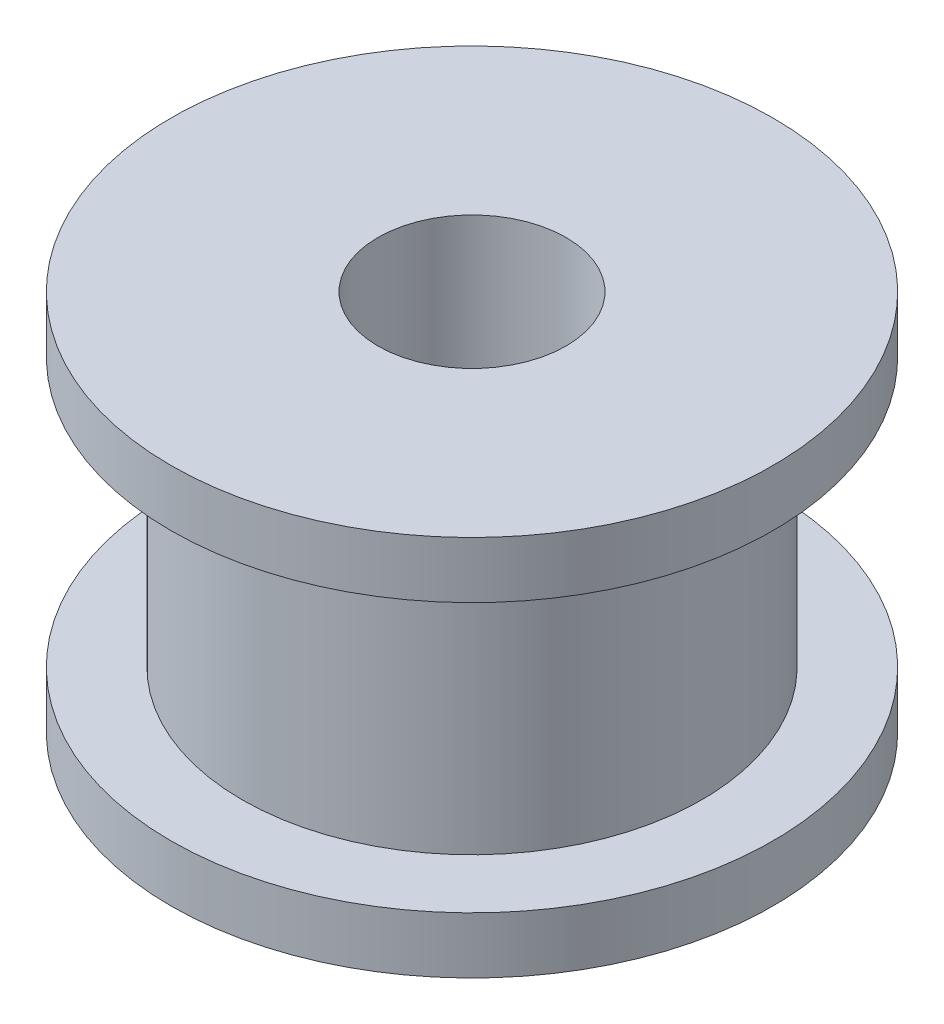
ISO-10303-21;
HEADER;
FILE_DESCRIPTION(('STEP AP214'),'2;1');
FILE_NAME('part.step','',(''),(''),'','','');
FILE_SCHEMA(('AUTOMOTIVE_DESIGN { 1 0 10303 214 1 1 1 1 }'));
ENDSEC;
DATA;
#1=APPLICATION_CONTEXT('core data for automotive mechanical design processes');
#2=APPLICATION_PROTOCOL_DEFINITION('international standard','automotive_design',2000,#1);
#3=PRODUCT_CONTEXT('',#1,'mechanical');
#4=PRODUCT('Part','Part','',(#3));
#5=PRODUCT_RELATED_PRODUCT_CATEGORY('part','',(#4));
#6=PRODUCT_DEFINITION_FORMATION('','',#4);
#7=PRODUCT_DEFINITION_CONTEXT('part definition',#1,'design');
#8=PRODUCT_DEFINITION('design','',#6,#7);
#9=PRODUCT_DEFINITION_SHAPE('','',#8);
#10=(LENGTH_UNIT() NAMED_UNIT(*) SI_UNIT(.MILLI.,.METRE.));
#11=(NAMED_UNIT(*) PLANE_ANGLE_UNIT() SI_UNIT($,.RADIAN.));
#12=(NAMED_UNIT(*) SI_UNIT($,.STERADIAN.) SOLID_ANGLE_UNIT());
#13=UNCERTAINTY_MEASURE_WITH_UNIT(LENGTH_MEASURE(1.E-05),#10,'distance_accuracy_value','');
#14=(GEOMETRIC_REPRESENTATION_CONTEXT(3) GLOBAL_UNCERTAINTY_ASSIGNED_CONTEXT((#13)) GLOBAL_UNIT_ASSIGNED_CONTEXT((#10,
#11,#12)) REPRESENTATION_CONTEXT('',''));
#15=CARTESIAN_POINT('',(0.,0.,0.));
#16=DIRECTION('',(0.,0.,1.));
#17=DIRECTION('',(1.,0.,0.));
#18=AXIS2_PLACEMENT_3D('',#15,#16,#17);
#19=CARTESIAN_POINT('',(0.,7.1,0.));
#20=DIRECTION('',(0.,-1.,0.));
#21=DIRECTION('',(0.,0.,-1.));
#22=AXIS2_PLACEMENT_3D('',#19,#20,#21);
#23=CYLINDRICAL_SURFACE('',#22,8.);
#24=CARTESIAN_POINT('',(0.,7.1,0.));
#25=DIRECTION('',(0.,1.,0.));
#26=DIRECTION('',(0.,0.,1.));
#27=AXIS2_PLACEMENT_3D('',#24,#25,#26);
#28=CIRCLE('',#27,8.);
#29=CARTESIAN_POINT('',(0.,7.1,8.));
#30=VERTEX_POINT('',#29);
#31=EDGE_CURVE('E41',#30,#30,#28,.T.);
#32=ORIENTED_EDGE('',*,*,#31,.F.);
#33=EDGE_LOOP('',(#32));
#34=FACE_BOUND('',#33,.T.);
#35=CARTESIAN_POINT('',(0.,5.6,0.));
#36=DIRECTION('',(0.,-1.,0.));
#37=DIRECTION('',(0.,0.,-1.));
#38=AXIS2_PLACEMENT_3D('',#35,#36,#37);
#39=CIRCLE('',#38,8.);
#40=CARTESIAN_POINT('',(0.,5.6,-8.));
#41=VERTEX_POINT('',#40);
#42=EDGE_CURVE('E59',#41,#41,#39,.T.);
#43=ORIENTED_EDGE('',*,*,#42,.F.);
#44=EDGE_LOOP('',(#43));
#45=FACE_BOUND('',#44,.T.);
#46=ADVANCED_FACE('F34',(#34,#45),#23,.T.);
#47=CARTESIAN_POINT('',(0.,16.,0.));
#48=DIRECTION('',(0.,-1.,0.));
#49=DIRECTION('',(0.,0.,-1.));
#50=AXIS2_PLACEMENT_3D('',#47,#48,#49);
#51=CYLINDRICAL_SURFACE('',#50,2.5);
#52=CARTESIAN_POINT('',(0.,15.74,0.));
#53=DIRECTION('',(0.,1.,0.));
#54=DIRECTION('',(0.,0.,1.));
#55=AXIS2_PLACEMENT_3D('',#52,#53,#54);
#56=CIRCLE('',#55,2.5);
#57=CARTESIAN_POINT('',(0.,15.74,2.5));
#58=VERTEX_POINT('',#57);
#59=EDGE_CURVE('E54',#58,#58,#56,.T.);
#60=ORIENTED_EDGE('',*,*,#59,.T.);
#61=EDGE_LOOP('',(#60));
#62=FACE_BOUND('',#61,.T.);
#63=CARTESIAN_POINT('',(0.,5.6,0.));
#64=DIRECTION('',(0.,-1.,0.));
#65=DIRECTION('',(0.,0.,-1.));
#66=AXIS2_PLACEMENT_3D('',#63,#64,#65);
#67=CIRCLE('',#66,2.5);
#68=CARTESIAN_POINT('',(0.,5.6,-2.5));
#69=VERTEX_POINT('',#68);
#70=EDGE_CURVE('E37',#69,#69,#67,.F.);
#71=ORIENTED_EDGE('',*,*,#70,.F.);
#72=EDGE_LOOP('',(#71));
#73=FACE_BOUND('',#72,.T.);
#74=ADVANCED_FACE('F68',(#62,#73),#51,.F.);
#75=CARTESIAN_POINT('',(0.,7.1,0.));
#76=DIRECTION('',(0.,1.,0.));
#77=DIRECTION('',(0.,0.,1.));
#78=AXIS2_PLACEMENT_3D('',#75,#76,#77);
#79=PLANE('',#78);
#80=CARTESIAN_POINT('',(0.,7.1,0.));
#81=DIRECTION('',(0.,1.,0.));
#82=DIRECTION('',(0.,0.,1.));
#83=AXIS2_PLACEMENT_3D('',#80,#81,#82);
#84=CIRCLE('',#83,6.11);
#85=CARTESIAN_POINT('',(0.,7.1,6.11));
#86=VERTEX_POINT('',#85);
#87=EDGE_CURVE('E10',#86,#86,#84,.T.);
#88=ORIENTED_EDGE('',*,*,#87,.F.);
#89=EDGE_LOOP('',(#88));
#90=FACE_BOUND('',#89,.T.);
#91=ORIENTED_EDGE('',*,*,#31,.T.);
#92=EDGE_LOOP('',(#91));
#93=FACE_BOUND('',#92,.T.);
#94=ADVANCED_FACE('F70',(#90,#93),#79,.T.);
#95=CARTESIAN_POINT('',(0.,14.24,0.));
#96=DIRECTION('',(0.,-1.,0.));
#97=DIRECTION('',(0.,0.,-1.));
#98=AXIS2_PLACEMENT_3D('',#95,#96,#97);
#99=CYLINDRICAL_SURFACE('',#98,6.11);
#100=CARTESIAN_POINT('',(0.,14.24,0.));
#101=DIRECTION('',(0.,1.,0.));
#102=DIRECTION('',(0.,0.,1.));
#103=AXIS2_PLACEMENT_3D('',#100,#101,#102);
#104=CIRCLE('',#103,6.11);
#105=CARTESIAN_POINT('',(0.,14.24,6.11));
#106=VERTEX_POINT('',#105);
#107=EDGE_CURVE('E46',#106,#106,#104,.T.);
#108=ORIENTED_EDGE('',*,*,#107,.F.);
#109=EDGE_LOOP('',(#108));
#110=FACE_BOUND('',#109,.T.);
#111=ORIENTED_EDGE('',*,*,#87,.T.);
#112=EDGE_LOOP('',(#111));
#113=FACE_BOUND('',#112,.T.);
#114=ADVANCED_FACE('F77',(#110,#113),#99,.T.);
#115=CARTESIAN_POINT('',(0.,14.24,0.));
#116=DIRECTION('',(0.,1.,0.));
#117=DIRECTION('',(0.,0.,1.));
#118=AXIS2_PLACEMENT_3D('',#115,#116,#117);
#119=PLANE('',#118);
#120=ORIENTED_EDGE('',*,*,#107,.T.);
#121=EDGE_LOOP('',(#120));
#122=FACE_BOUND('',#121,.T.);
#123=CARTESIAN_POINT('',(0.,14.24,0.));
#124=DIRECTION('',(0.,1.,0.));
#125=DIRECTION('',(0.,0.,1.));
#126=AXIS2_PLACEMENT_3D('',#123,#124,#125);
#127=CIRCLE('',#126,8.);
#128=CARTESIAN_POINT('',(0.,14.24,8.));
#129=VERTEX_POINT('',#128);
#130=EDGE_CURVE('E51',#129,#129,#127,.T.);
#131=ORIENTED_EDGE('',*,*,#130,.F.);
#132=EDGE_LOOP('',(#131));
#133=FACE_BOUND('',#132,.T.);
#134=ADVANCED_FACE('F85',(#122,#133),#119,.F.);
#135=CARTESIAN_POINT('',(0.,15.74,0.));
#136=DIRECTION('',(0.,1.,0.));
#137=DIRECTION('',(0.,0.,1.));
#138=AXIS2_PLACEMENT_3D('',#135,#136,#137);
#139=PLANE('',#138);
#140=ORIENTED_EDGE('',*,*,#59,.F.);
#141=EDGE_LOOP('',(#140));
#142=FACE_BOUND('',#141,.T.);
#143=CARTESIAN_POINT('',(0.,15.74,0.));
#144=DIRECTION('',(0.,1.,0.));
#145=DIRECTION('',(0.,0.,1.));
#146=AXIS2_PLACEMENT_3D('',#143,#144,#145);
#147=CIRCLE('',#146,8.);
#148=CARTESIAN_POINT('',(0.,15.74,8.));
#149=VERTEX_POINT('',#148);
#150=EDGE_CURVE('E50',#149,#149,#147,.T.);
#151=ORIENTED_EDGE('',*,*,#150,.T.);
#152=EDGE_LOOP('',(#151));
#153=FACE_BOUND('',#152,.T.);
#154=ADVANCED_FACE('F90',(#142,#153),#139,.T.);
#155=CARTESIAN_POINT('',(0.,15.74,0.));
#156=DIRECTION('',(0.,-1.,0.));
#157=DIRECTION('',(0.,0.,-1.));
#158=AXIS2_PLACEMENT_3D('',#155,#156,#157);
#159=CYLINDRICAL_SURFACE('',#158,8.);
#160=ORIENTED_EDGE('',*,*,#150,.F.);
#161=EDGE_LOOP('',(#160));
#162=FACE_BOUND('',#161,.T.);
#163=ORIENTED_EDGE('',*,*,#130,.T.);
#164=EDGE_LOOP('',(#163));
#165=FACE_BOUND('',#164,.T.);
#166=ADVANCED_FACE('F82',(#162,#165),#159,.T.);
#167=CARTESIAN_POINT('',(10.,5.6,8.));
#168=DIRECTION('',(0.,-1.,0.));
#169=DIRECTION('',(0.,0.,-1.));
#170=AXIS2_PLACEMENT_3D('',#167,#168,#169);
#171=PLANE('',#170);
#172=ORIENTED_EDGE('',*,*,#70,.T.);
#173=EDGE_LOOP('',(#172));
#174=FACE_BOUND('',#173,.T.);
#175=ORIENTED_EDGE('',*,*,#42,.T.);
#176=EDGE_LOOP('',(#175));
#177=FACE_BOUND('',#176,.T.);
#178=ADVANCED_FACE('F66',(#174,#177),#171,.T.);
#179=CLOSED_SHELL('',(#46,#74,#94,#114,#134,#154,#166,#178));
#180=MANIFOLD_SOLID_BREP('B2',#179);
#181=ADVANCED_BREP_SHAPE_REPRESENTATION('',(#18,#180),#14);
#182=SHAPE_DEFINITION_REPRESENTATION(#9,#181);
ENDSEC;
END-ISO-10303-21;
